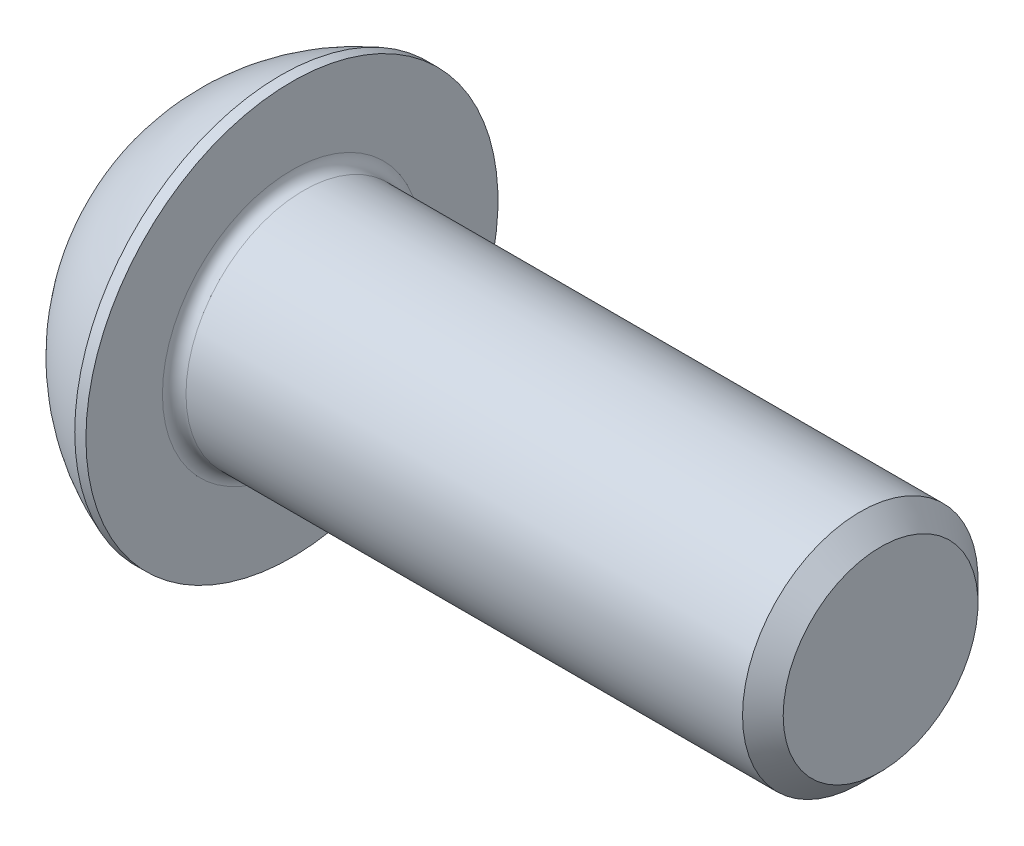
ISO-10303-21;
HEADER;
FILE_DESCRIPTION(('STEP AP214'),'2;1');
FILE_NAME('part.step','',(''),(''),'','','');
FILE_SCHEMA(('AUTOMOTIVE_DESIGN { 1 0 10303 214 1 1 1 1 }'));
ENDSEC;
DATA;
#1=APPLICATION_CONTEXT('core data for automotive mechanical design processes');
#2=APPLICATION_PROTOCOL_DEFINITION('international standard','automotive_design',2000,#1);
#3=PRODUCT_CONTEXT('',#1,'mechanical');
#4=PRODUCT('Part','Part','',(#3));
#5=PRODUCT_RELATED_PRODUCT_CATEGORY('part','',(#4));
#6=PRODUCT_DEFINITION_FORMATION('','',#4);
#7=PRODUCT_DEFINITION_CONTEXT('part definition',#1,'design');
#8=PRODUCT_DEFINITION('design','',#6,#7);
#9=PRODUCT_DEFINITION_SHAPE('','',#8);
#10=(LENGTH_UNIT() NAMED_UNIT(*) SI_UNIT(.MILLI.,.METRE.));
#11=(NAMED_UNIT(*) PLANE_ANGLE_UNIT() SI_UNIT($,.RADIAN.));
#12=(NAMED_UNIT(*) SI_UNIT($,.STERADIAN.) SOLID_ANGLE_UNIT());
#13=UNCERTAINTY_MEASURE_WITH_UNIT(LENGTH_MEASURE(1.E-05),#10,'distance_accuracy_value','');
#14=(GEOMETRIC_REPRESENTATION_CONTEXT(3) GLOBAL_UNCERTAINTY_ASSIGNED_CONTEXT((#13)) GLOBAL_UNIT_ASSIGNED_CONTEXT((#10,
#11,#12)) REPRESENTATION_CONTEXT('',''));
#15=CARTESIAN_POINT('',(0.,0.,0.));
#16=DIRECTION('',(0.,0.,1.));
#17=DIRECTION('',(1.,0.,0.));
#18=AXIS2_PLACEMENT_3D('',#15,#16,#17);
#19=CARTESIAN_POINT('',(0.,0.,0.));
#20=DIRECTION('',(-1.,0.,0.));
#21=DIRECTION('',(0.,0.,1.));
#22=AXIS2_PLACEMENT_3D('',#19,#20,#21);
#23=PLANE('',#22);
#24=CARTESIAN_POINT('',(0.,0.,0.));
#25=DIRECTION('',(-1.,0.,0.));
#26=DIRECTION('',(0.,0.,1.));
#27=AXIS2_PLACEMENT_3D('',#24,#25,#26);
#28=CIRCLE('',#27,3.5);
#29=CARTESIAN_POINT('',(0.,3.5,0.));
#30=VERTEX_POINT('',#29);
#31=EDGE_CURVE('E161',#30,#30,#28,.T.);
#32=ORIENTED_EDGE('',*,*,#31,.T.);
#33=EDGE_LOOP('',(#32));
#34=FACE_BOUND('',#33,.T.);
#35=DIRECTION('',(0.,-1.,0.));
#36=VECTOR('',#35,1.);
#37=CARTESIAN_POINT('',(0.,-1.44337567297406,2.5));
#38=LINE('',#37,#36);
#39=CARTESIAN_POINT('',(0.,1.44337567297407,2.5));
#40=VERTEX_POINT('',#39);
#41=CARTESIAN_POINT('',(0.,-1.44337567297406,2.5));
#42=VERTEX_POINT('',#41);
#43=EDGE_CURVE('E51',#40,#42,#38,.T.);
#44=ORIENTED_EDGE('',*,*,#43,.T.);
#45=DIRECTION('',(0.,-0.5,-0.866025403784438));
#46=VECTOR('',#45,1.);
#47=CARTESIAN_POINT('',(0.,-2.88675134594813,0.));
#48=LINE('',#47,#46);
#49=CARTESIAN_POINT('',(0.,-2.88675134594813,0.));
#50=VERTEX_POINT('',#49);
#51=EDGE_CURVE('E254',#42,#50,#48,.T.);
#52=ORIENTED_EDGE('',*,*,#51,.T.);
#53=DIRECTION('',(0.,0.5,-0.866025403784439));
#54=VECTOR('',#53,1.);
#55=CARTESIAN_POINT('',(0.,-1.44337567297406,-2.5));
#56=LINE('',#55,#54);
#57=CARTESIAN_POINT('',(0.,-1.44337567297406,-2.5));
#58=VERTEX_POINT('',#57);
#59=EDGE_CURVE('E136',#50,#58,#56,.T.);
#60=ORIENTED_EDGE('',*,*,#59,.T.);
#61=DIRECTION('',(0.,1.,0.));
#62=VECTOR('',#61,1.);
#63=CARTESIAN_POINT('',(0.,1.44337567297407,-2.5));
#64=LINE('',#63,#62);
#65=CARTESIAN_POINT('',(0.,1.44337567297407,-2.5));
#66=VERTEX_POINT('',#65);
#67=EDGE_CURVE('E257',#58,#66,#64,.T.);
#68=ORIENTED_EDGE('',*,*,#67,.T.);
#69=DIRECTION('',(0.,0.5,0.866025403784438));
#70=VECTOR('',#69,1.);
#71=CARTESIAN_POINT('',(0.,2.88675134594813,0.));
#72=LINE('',#71,#70);
#73=CARTESIAN_POINT('',(0.,2.88675134594813,0.));
#74=VERTEX_POINT('',#73);
#75=EDGE_CURVE('E259',#66,#74,#72,.T.);
#76=ORIENTED_EDGE('',*,*,#75,.T.);
#77=DIRECTION('',(0.,-0.5,0.866025403784438));
#78=VECTOR('',#77,1.);
#79=CARTESIAN_POINT('',(0.,1.44337567297407,2.5));
#80=LINE('',#79,#78);
#81=EDGE_CURVE('E261',#74,#40,#80,.T.);
#82=ORIENTED_EDGE('',*,*,#81,.T.);
#83=EDGE_LOOP('',(#44,#52,#60,#68,#76,#82));
#84=FACE_BOUND('',#83,.T.);
#85=ADVANCED_FACE('F36',(#34,#84),#23,.T.);
#86=CARTESIAN_POINT('',(6.58089552238806,0.,0.));
#87=DIRECTION('',(-1.,0.,0.));
#88=DIRECTION('',(0.,1.,0.));
#89=AXIS2_PLACEMENT_3D('',#86,#87,#88);
#90=SPHERICAL_SURFACE('',#89,7.45373637020972);
#91=CARTESIAN_POINT('',(4.02,0.,0.));
#92=DIRECTION('',(-1.,0.,0.));
#93=DIRECTION('',(0.,0.,1.));
#94=AXIS2_PLACEMENT_3D('',#91,#92,#93);
#95=CIRCLE('',#94,7.);
#96=CARTESIAN_POINT('',(4.02,7.,0.));
#97=VERTEX_POINT('',#96);
#98=EDGE_CURVE('E158',#97,#97,#95,.T.);
#99=CARTESIAN_POINT('',(4.02,7.,0.));
#100=CARTESIAN_POINT('',(3.96667727076465,6.98049242402172,0.));
#101=CARTESIAN_POINT('',(3.913577528648,6.96037534487455,0.));
#102=CARTESIAN_POINT('',(3.8078515532553,6.91893318326458,0.));
#103=CARTESIAN_POINT('',(3.75522531997925,6.89760810080177,0.));
#104=CARTESIAN_POINT('',(3.65047389687093,6.85376093558268,0.));
#105=CARTESIAN_POINT('',(3.59834870703866,6.83123885282639,0.));
#106=CARTESIAN_POINT('',(3.49462657751034,6.7850094841704,0.));
#107=CARTESIAN_POINT('',(3.44302963781429,6.7613021982707,0.));
#108=CARTESIAN_POINT('',(3.34039095714278,6.71271479411965,0.));
#109=CARTESIAN_POINT('',(3.28934921616733,6.6878346758683,0.));
#110=CARTESIAN_POINT('',(3.18784758682982,6.63691460241549,0.));
#111=CARTESIAN_POINT('',(3.13738769846775,6.61087464721403,0.));
#112=CARTESIAN_POINT('',(3.03707612567073,6.55764849769805,0.));
#113=CARTESIAN_POINT('',(2.98722444123577,6.53046230338352,0.));
#114=CARTESIAN_POINT('',(2.88815530965033,6.47495787293607,0.));
#115=CARTESIAN_POINT('',(2.83893786249984,6.44663963680314,0.));
#116=CARTESIAN_POINT('',(2.74116290772229,6.38888591095228,0.));
#117=CARTESIAN_POINT('',(2.69260540009523,6.35945042123436,0.));
#118=CARTESIAN_POINT('',(2.59617568194692,6.29947755995901,0.));
#119=CARTESIAN_POINT('',(2.54830347142567,6.2689401884016,0.));
#120=CARTESIAN_POINT('',(2.45326934720369,6.20677951059818,0.));
#121=CARTESIAN_POINT('',(2.40610743350296,6.17515620435217,0.));
#122=CARTESIAN_POINT('',(2.31251853170541,6.1108401714212,0.));
#123=CARTESIAN_POINT('',(2.2660915436086,6.07814744473625,0.));
#124=CARTESIAN_POINT('',(2.17399673801164,6.01170964364606,0.));
#125=CARTESIAN_POINT('',(2.12832892051151,5.97796456924083,0.));
#126=CARTESIAN_POINT('',(2.03777630464825,5.90943969498364,0.));
#127=CARTESIAN_POINT('',(1.99289150628513,5.87465989513168,0.));
#128=CARTESIAN_POINT('',(1.90392836832988,5.80408373260638,0.));
#129=CARTESIAN_POINT('',(1.85985002873775,5.76828736993305,0.));
#130=CARTESIAN_POINT('',(1.77252282681141,5.69569677525744,0.));
#131=CARTESIAN_POINT('',(1.72927396447721,5.65890254325517,0.));
#132=CARTESIAN_POINT('',(1.64362830238602,5.58433542451906,0.));
#133=CARTESIAN_POINT('',(1.60123150262904,5.54656253778523,0.));
#134=CARTESIAN_POINT('',(1.51731210604947,5.4700578352542,0.));
#135=CARTESIAN_POINT('',(1.47578950922687,5.431326019457,0.));
#136=CARTESIAN_POINT('',(1.39364020234904,5.35292368523707,0.));
#137=CARTESIAN_POINT('',(1.35301349229381,5.31325316681434,0.));
#138=CARTESIAN_POINT('',(1.27267717493576,5.23299414398831,0.));
#139=CARTESIAN_POINT('',(1.23296756763295,5.19240563958501,0.));
#140=CARTESIAN_POINT('',(1.15448619283766,5.1103318408312,0.));
#141=CARTESIAN_POINT('',(1.11571442534517,5.0688465464807,0.));
#142=CARTESIAN_POINT('',(1.03912897747163,4.98500083218559,0.));
#143=CARTESIAN_POINT('',(1.00131529709057,4.94264041224098,0.));
#144=CARTESIAN_POINT('',(0.926665770412102,4.85706656811615,0.));
#145=CARTESIAN_POINT('',(0.889829924114693,4.81385314393593,0.));
#146=CARTESIAN_POINT('',(0.817155301929323,4.72659585815459,0.));
#147=CARTESIAN_POINT('',(0.781316526041361,4.68255199655347,0.));
#148=CARTESIAN_POINT('',(0.710654760328621,4.59365683640532,0.));
#149=CARTESIAN_POINT('',(0.675831770503841,4.54880553785828,0.));
#150=CARTESIAN_POINT('',(0.607219762051194,4.45831892598402,0.));
#151=CARTESIAN_POINT('',(0.573430743423327,4.41268361265678,0.));
#152=CARTESIAN_POINT('',(0.506904322758881,4.32065280269138,0.));
#153=CARTESIAN_POINT('',(0.474166920722302,4.27425730605322,0.));
#154=CARTESIAN_POINT('',(0.409760828646038,4.18073035837463,0.));
#155=CARTESIAN_POINT('',(0.378092138606352,4.1335989073342,0.));
#156=CARTESIAN_POINT('',(0.31584001087466,4.03862466237799,0.));
#157=CARTESIAN_POINT('',(0.285256573182654,3.99078186846222,0.));
#158=CARTESIAN_POINT('',(0.2251909123934,3.89440992714022,0.));
#159=CARTESIAN_POINT('',(0.195708689296152,3.84588077973399,0.));
#160=CARTESIAN_POINT('',(0.137860887287448,3.74816145542334,0.));
#161=CARTESIAN_POINT('',(0.109495308375992,3.69897127851891,0.));
#162=CARTESIAN_POINT('',(0.0538954828937622,3.59995565329747,0.));
#163=CARTESIAN_POINT('',(0.0266612363229883,3.55013020498047,0.));
#164=CARTESIAN_POINT('',(0.,3.5,0.));
#165=B_SPLINE_CURVE_WITH_KNOTS('',3,(#99,#100,#101,#102,#103,#104,#105,#106,#107,#108,#109,#110,
#111,#112,#113,#114,#115,#116,#117,#118,#119,#120,#121,#122,#123,#124,#125,#126,#127,#128,#129,
#130,#131,#132,#133,#134,#135,#136,#137,#138,#139,#140,#141,#142,#143,#144,#145,#146,#147,#148,
#149,#150,#151,#152,#153,#154,#155,#156,#157,#158,#159,#160,#161,#162,#163,#164),.UNSPECIFIED.,
.F.,.F.,(4,2,2,2,2,2,2,2,2,2,2,2,2,2,2,2,2,2,2,2,2,2,2,2,2,2,2,2,2,2,2,2,4),(0.,
0.170333394580244,0.340666789160487,0.51100018374073,0.681333578320973,0.851666972901216,
1.02200036748146,1.1923337620617,1.36266715664194,1.53300055122219,1.70333394580243,
1.87366734038267,2.04400073496292,2.21433412954316,2.3846675241234,2.55500091870365,
2.72533431328389,2.89566770786413,3.06600110244437,3.23633449702462,3.40666789160486,
3.5770012861851,3.74733468076535,3.91766807534559,4.08800146992583,4.25833486450608,
4.42866825908632,4.59900165366656,4.76933504824681,4.93966844282705,5.11000183740729,
5.28033523198754,5.45066862656778),.UNSPECIFIED.);
#166=EDGE_CURVE('BSEAM182',#97,#30,#165,.T.);
#167=ORIENTED_EDGE('',*,*,#98,.T.);
#168=ORIENTED_EDGE('',*,*,#31,.F.);
#169=ORIENTED_EDGE('',*,*,#166,.T.);
#170=ORIENTED_EDGE('',*,*,#166,.F.);
#171=EDGE_LOOP('',(#167,#169,#168,#170));
#172=FACE_BOUND('',#171,.T.);
#173=ADVANCED_FACE('F182',(#172),#90,.T.);
#174=CARTESIAN_POINT('',(0.,0.,0.));
#175=DIRECTION('',(-1.,0.,0.));
#176=DIRECTION('',(0.,0.,1.));
#177=AXIS2_PLACEMENT_3D('',#174,#175,#176);
#178=CYLINDRICAL_SURFACE('',#177,7.);
#179=ORIENTED_EDGE('',*,*,#98,.F.);
#180=EDGE_LOOP('',(#179));
#181=FACE_BOUND('',#180,.T.);
#182=CARTESIAN_POINT('',(4.4,0.,0.));
#183=DIRECTION('',(-1.,0.,0.));
#184=DIRECTION('',(0.,0.,1.));
#185=AXIS2_PLACEMENT_3D('',#182,#183,#184);
#186=CIRCLE('',#185,7.);
#187=CARTESIAN_POINT('',(4.4,0.,7.));
#188=VERTEX_POINT('',#187);
#189=EDGE_CURVE('E155',#188,#188,#186,.T.);
#190=ORIENTED_EDGE('',*,*,#189,.T.);
#191=EDGE_LOOP('',(#190));
#192=FACE_BOUND('',#191,.T.);
#193=ADVANCED_FACE('F187',(#181,#192),#178,.T.);
#194=CARTESIAN_POINT('',(4.4,4.,0.));
#195=DIRECTION('',(-1.,0.,0.));
#196=DIRECTION('',(0.,0.,1.));
#197=AXIS2_PLACEMENT_3D('',#194,#195,#196);
#198=PLANE('',#197);
#199=CARTESIAN_POINT('',(4.4,0.,0.));
#200=DIRECTION('',(-1.,0.,0.));
#201=DIRECTION('',(0.,0.,1.));
#202=AXIS2_PLACEMENT_3D('',#199,#200,#201);
#203=CIRCLE('',#202,4.4);
#204=CARTESIAN_POINT('',(4.4,0.,4.4));
#205=VERTEX_POINT('',#204);
#206=EDGE_CURVE('E44',#205,#205,#203,.T.);
#207=ORIENTED_EDGE('',*,*,#206,.T.);
#208=EDGE_LOOP('',(#207));
#209=FACE_BOUND('',#208,.T.);
#210=ORIENTED_EDGE('',*,*,#189,.F.);
#211=EDGE_LOOP('',(#210));
#212=FACE_BOUND('',#211,.T.);
#213=ADVANCED_FACE('F166',(#209,#212),#198,.F.);
#214=CARTESIAN_POINT('',(0.,0.,0.));
#215=DIRECTION('',(-1.,0.,0.));
#216=DIRECTION('',(0.,0.,1.));
#217=AXIS2_PLACEMENT_3D('',#214,#215,#216);
#218=CYLINDRICAL_SURFACE('',#217,4.);
#219=CARTESIAN_POINT('',(4.8,0.,0.));
#220=DIRECTION('',(-1.,0.,0.));
#221=DIRECTION('',(0.,0.,1.));
#222=AXIS2_PLACEMENT_3D('',#219,#220,#221);
#223=CIRCLE('',#222,4.);
#224=CARTESIAN_POINT('',(4.8,0.,4.));
#225=VERTEX_POINT('',#224);
#226=EDGE_CURVE('E11',#225,#225,#223,.F.);
#227=ORIENTED_EDGE('',*,*,#226,.T.);
#228=EDGE_LOOP('',(#227));
#229=FACE_BOUND('',#228,.T.);
#230=CARTESIAN_POINT('',(23.7095,0.,0.));
#231=DIRECTION('',(-1.,0.,0.));
#232=DIRECTION('',(0.,0.,1.));
#233=AXIS2_PLACEMENT_3D('',#230,#231,#232);
#234=CIRCLE('',#233,4.);
#235=CARTESIAN_POINT('',(23.7095,0.,4.));
#236=VERTEX_POINT('',#235);
#237=EDGE_CURVE('E152',#236,#236,#234,.T.);
#238=ORIENTED_EDGE('',*,*,#237,.T.);
#239=EDGE_LOOP('',(#238));
#240=FACE_BOUND('',#239,.T.);
#241=ADVANCED_FACE('F196',(#229,#240),#218,.T.);
#242=CARTESIAN_POINT('',(24.4,0.,0.));
#243=DIRECTION('',(-1.,0.,0.));
#244=DIRECTION('',(0.,0.,1.));
#245=AXIS2_PLACEMENT_3D('',#242,#243,#244);
#246=CONICAL_SURFACE('',#245,3.3095,0.785398163397445);
#247=ORIENTED_EDGE('',*,*,#237,.F.);
#248=EDGE_LOOP('',(#247));
#249=FACE_BOUND('',#248,.T.);
#250=CARTESIAN_POINT('',(24.4,0.,0.));
#251=DIRECTION('',(-1.,0.,0.));
#252=DIRECTION('',(0.,0.,1.));
#253=AXIS2_PLACEMENT_3D('',#250,#251,#252);
#254=CIRCLE('',#253,3.3095);
#255=CARTESIAN_POINT('',(24.4,0.,3.3095));
#256=VERTEX_POINT('',#255);
#257=EDGE_CURVE('E148',#256,#256,#254,.T.);
#258=ORIENTED_EDGE('',*,*,#257,.T.);
#259=EDGE_LOOP('',(#258));
#260=FACE_BOUND('',#259,.T.);
#261=ADVANCED_FACE('F177',(#249,#260),#246,.T.);
#262=CARTESIAN_POINT('',(24.4,0.,0.));
#263=DIRECTION('',(-1.,0.,0.));
#264=DIRECTION('',(0.,0.,1.));
#265=AXIS2_PLACEMENT_3D('',#262,#263,#264);
#266=PLANE('',#265);
#267=ORIENTED_EDGE('',*,*,#257,.F.);
#268=EDGE_LOOP('',(#267));
#269=FACE_BOUND('',#268,.T.);
#270=ADVANCED_FACE('F170',(#269),#266,.F.);
#271=CARTESIAN_POINT('',(4.8,0.,0.));
#272=DIRECTION('',(-1.,0.,0.));
#273=DIRECTION('',(0.,0.,1.));
#274=AXIS2_PLACEMENT_3D('',#271,#272,#273);
#275=TOROIDAL_SURFACE('',#274,4.4,0.4);
#276=ORIENTED_EDGE('',*,*,#226,.F.);
#277=EDGE_LOOP('',(#276));
#278=FACE_BOUND('',#277,.T.);
#279=ORIENTED_EDGE('',*,*,#206,.F.);
#280=EDGE_LOOP('',(#279));
#281=FACE_BOUND('',#280,.T.);
#282=ADVANCED_FACE('F38',(#278,#281),#275,.F.);
#283=CARTESIAN_POINT('',(2.6,-2.88675134594813,0.));
#284=DIRECTION('',(0.,0.866025403784438,-0.5));
#285=DIRECTION('',(0.,0.5,0.866025403784439));
#286=AXIS2_PLACEMENT_3D('',#283,#284,#285);
#287=PLANE('',#286);
#288=DIRECTION('',(0.,-0.5,-0.866025403784438));
#289=VECTOR('',#288,1.);
#290=CARTESIAN_POINT('',(2.6,-2.88675134594813,0.));
#291=LINE('',#290,#289);
#292=CARTESIAN_POINT('',(2.6,-1.44337567297406,2.5));
#293=VERTEX_POINT('',#292);
#294=CARTESIAN_POINT('',(2.6,-2.1650635094611,1.25));
#295=VERTEX_POINT('',#294);
#296=EDGE_CURVE('E119',#293,#295,#291,.T.);
#297=ORIENTED_EDGE('',*,*,#296,.T.);
#298=CARTESIAN_POINT('',(2.6,-2.88675134594813,0.));
#299=VERTEX_POINT('',#298);
#300=EDGE_CURVE('E112',#295,#299,#291,.T.);
#301=ORIENTED_EDGE('',*,*,#300,.T.);
#302=DIRECTION('',(-1.,0.,0.));
#303=VECTOR('',#302,1.);
#304=CARTESIAN_POINT('',(2.6,-2.88675134594813,0.));
#305=LINE('',#304,#303);
#306=EDGE_CURVE('E116',#299,#50,#305,.T.);
#307=ORIENTED_EDGE('',*,*,#306,.T.);
#308=ORIENTED_EDGE('',*,*,#51,.F.);
#309=DIRECTION('',(-1.,0.,0.));
#310=VECTOR('',#309,1.);
#311=CARTESIAN_POINT('',(2.6,-1.44337567297406,2.5));
#312=LINE('',#311,#310);
#313=EDGE_CURVE('E244',#293,#42,#312,.T.);
#314=ORIENTED_EDGE('',*,*,#313,.F.);
#315=EDGE_LOOP('',(#297,#301,#307,#308,#314));
#316=FACE_BOUND('',#315,.T.);
#317=ADVANCED_FACE('F114',(#316),#287,.T.);
#318=CARTESIAN_POINT('',(2.6,-1.44337567297406,-2.5));
#319=DIRECTION('',(0.,0.866025403784439,0.5));
#320=DIRECTION('',(0.,-0.5,0.866025403784439));
#321=AXIS2_PLACEMENT_3D('',#318,#319,#320);
#322=PLANE('',#321);
#323=DIRECTION('',(0.,0.5,-0.866025403784439));
#324=VECTOR('',#323,1.);
#325=CARTESIAN_POINT('',(2.6,-1.44337567297406,-2.5));
#326=LINE('',#325,#324);
#327=CARTESIAN_POINT('',(2.6,-2.1650635094611,-1.25));
#328=VERTEX_POINT('',#327);
#329=EDGE_CURVE('E124',#299,#328,#326,.T.);
#330=ORIENTED_EDGE('',*,*,#329,.T.);
#331=CARTESIAN_POINT('',(2.6,-1.44337567297406,-2.5));
#332=VERTEX_POINT('',#331);
#333=EDGE_CURVE('E131',#328,#332,#326,.T.);
#334=ORIENTED_EDGE('',*,*,#333,.T.);
#335=DIRECTION('',(-1.,0.,0.));
#336=VECTOR('',#335,1.);
#337=CARTESIAN_POINT('',(2.6,-1.44337567297406,-2.5));
#338=LINE('',#337,#336);
#339=EDGE_CURVE('E138',#332,#58,#338,.T.);
#340=ORIENTED_EDGE('',*,*,#339,.T.);
#341=ORIENTED_EDGE('',*,*,#59,.F.);
#342=ORIENTED_EDGE('',*,*,#306,.F.);
#343=EDGE_LOOP('',(#330,#334,#340,#341,#342));
#344=FACE_BOUND('',#343,.T.);
#345=ADVANCED_FACE('F134',(#344),#322,.T.);
#346=CARTESIAN_POINT('',(2.6,1.44337567297407,-2.5));
#347=DIRECTION('',(0.,0.,1.));
#348=DIRECTION('',(1.,0.,0.));
#349=AXIS2_PLACEMENT_3D('',#346,#347,#348);
#350=PLANE('',#349);
#351=DIRECTION('',(0.,1.,0.));
#352=VECTOR('',#351,1.);
#353=CARTESIAN_POINT('',(2.6,1.44337567297407,-2.5));
#354=LINE('',#353,#352);
#355=CARTESIAN_POINT('',(2.6,0.,-2.5));
#356=VERTEX_POINT('',#355);
#357=EDGE_CURVE('E280',#332,#356,#354,.T.);
#358=ORIENTED_EDGE('',*,*,#357,.T.);
#359=CARTESIAN_POINT('',(2.6,1.44337567297407,-2.5));
#360=VERTEX_POINT('',#359);
#361=EDGE_CURVE('E130',#356,#360,#354,.T.);
#362=ORIENTED_EDGE('',*,*,#361,.T.);
#363=DIRECTION('',(-1.,0.,0.));
#364=VECTOR('',#363,1.);
#365=CARTESIAN_POINT('',(2.6,1.44337567297407,-2.5));
#366=LINE('',#365,#364);
#367=EDGE_CURVE('E143',#360,#66,#366,.T.);
#368=ORIENTED_EDGE('',*,*,#367,.T.);
#369=ORIENTED_EDGE('',*,*,#67,.F.);
#370=ORIENTED_EDGE('',*,*,#339,.F.);
#371=EDGE_LOOP('',(#358,#362,#368,#369,#370));
#372=FACE_BOUND('',#371,.T.);
#373=ADVANCED_FACE('F210',(#372),#350,.T.);
#374=CARTESIAN_POINT('',(2.6,2.88675134594813,0.));
#375=DIRECTION('',(0.,-0.866025403784438,0.5));
#376=DIRECTION('',(0.,-0.5,-0.866025403784439));
#377=AXIS2_PLACEMENT_3D('',#374,#375,#376);
#378=PLANE('',#377);
#379=DIRECTION('',(0.,0.5,0.866025403784438));
#380=VECTOR('',#379,1.);
#381=CARTESIAN_POINT('',(2.6,2.88675134594813,0.));
#382=LINE('',#381,#380);
#383=CARTESIAN_POINT('',(2.6,2.1650635094611,-1.25));
#384=VERTEX_POINT('',#383);
#385=EDGE_CURVE('E286',#360,#384,#382,.T.);
#386=ORIENTED_EDGE('',*,*,#385,.T.);
#387=CARTESIAN_POINT('',(2.6,2.88675134594813,0.));
#388=VERTEX_POINT('',#387);
#389=EDGE_CURVE('E284',#384,#388,#382,.T.);
#390=ORIENTED_EDGE('',*,*,#389,.T.);
#391=DIRECTION('',(-1.,0.,0.));
#392=VECTOR('',#391,1.);
#393=CARTESIAN_POINT('',(2.6,2.88675134594813,0.));
#394=LINE('',#393,#392);
#395=EDGE_CURVE('E266',#388,#74,#394,.T.);
#396=ORIENTED_EDGE('',*,*,#395,.T.);
#397=ORIENTED_EDGE('',*,*,#75,.F.);
#398=ORIENTED_EDGE('',*,*,#367,.F.);
#399=EDGE_LOOP('',(#386,#390,#396,#397,#398));
#400=FACE_BOUND('',#399,.T.);
#401=ADVANCED_FACE('F213',(#400),#378,.T.);
#402=CARTESIAN_POINT('',(2.6,1.44337567297407,2.5));
#403=DIRECTION('',(0.,-0.866025403784438,-0.5));
#404=DIRECTION('',(0.,0.5,-0.866025403784438));
#405=AXIS2_PLACEMENT_3D('',#402,#403,#404);
#406=PLANE('',#405);
#407=DIRECTION('',(0.,-0.5,0.866025403784438));
#408=VECTOR('',#407,1.);
#409=CARTESIAN_POINT('',(2.6,1.44337567297407,2.5));
#410=LINE('',#409,#408);
#411=CARTESIAN_POINT('',(2.6,2.1650635094611,1.25));
#412=VERTEX_POINT('',#411);
#413=EDGE_CURVE('E250',#388,#412,#410,.T.);
#414=ORIENTED_EDGE('',*,*,#413,.T.);
#415=CARTESIAN_POINT('',(2.6,1.44337567297407,2.5));
#416=VERTEX_POINT('',#415);
#417=EDGE_CURVE('E242',#412,#416,#410,.T.);
#418=ORIENTED_EDGE('',*,*,#417,.T.);
#419=DIRECTION('',(-1.,0.,0.));
#420=VECTOR('',#419,1.);
#421=CARTESIAN_POINT('',(2.6,1.44337567297407,2.5));
#422=LINE('',#421,#420);
#423=EDGE_CURVE('E248',#416,#40,#422,.T.);
#424=ORIENTED_EDGE('',*,*,#423,.T.);
#425=ORIENTED_EDGE('',*,*,#81,.F.);
#426=ORIENTED_EDGE('',*,*,#395,.F.);
#427=EDGE_LOOP('',(#414,#418,#424,#425,#426));
#428=FACE_BOUND('',#427,.T.);
#429=ADVANCED_FACE('F217',(#428),#406,.T.);
#430=CARTESIAN_POINT('',(2.6,-1.44337567297406,2.5));
#431=DIRECTION('',(0.,0.,-1.));
#432=DIRECTION('',(-1.,0.,0.));
#433=AXIS2_PLACEMENT_3D('',#430,#431,#432);
#434=PLANE('',#433);
#435=DIRECTION('',(0.,-1.,0.));
#436=VECTOR('',#435,1.);
#437=CARTESIAN_POINT('',(2.6,-1.44337567297406,2.5));
#438=LINE('',#437,#436);
#439=CARTESIAN_POINT('',(2.6,0.,2.5));
#440=VERTEX_POINT('',#439);
#441=EDGE_CURVE('E59',#416,#440,#438,.T.);
#442=ORIENTED_EDGE('',*,*,#441,.T.);
#443=EDGE_CURVE('E245',#440,#293,#438,.T.);
#444=ORIENTED_EDGE('',*,*,#443,.T.);
#445=ORIENTED_EDGE('',*,*,#313,.T.);
#446=ORIENTED_EDGE('',*,*,#43,.F.);
#447=ORIENTED_EDGE('',*,*,#423,.F.);
#448=EDGE_LOOP('',(#442,#444,#445,#446,#447));
#449=FACE_BOUND('',#448,.T.);
#450=ADVANCED_FACE('F221',(#449),#434,.T.);
#451=CARTESIAN_POINT('',(2.6,0.,5.));
#452=DIRECTION('',(-1.,0.,0.));
#453=DIRECTION('',(0.,0.,1.));
#454=AXIS2_PLACEMENT_3D('',#451,#452,#453);
#455=PLANE('',#454);
#456=ORIENTED_EDGE('',*,*,#441,.F.);
#457=ORIENTED_EDGE('',*,*,#417,.F.);
#458=CARTESIAN_POINT('',(2.6,0.,0.));
#459=DIRECTION('',(-1.,0.,0.));
#460=DIRECTION('',(0.,0.,1.));
#461=AXIS2_PLACEMENT_3D('',#458,#459,#460);
#462=CIRCLE('',#461,2.5);
#463=EDGE_CURVE('E142',#440,#412,#462,.T.);
#464=ORIENTED_EDGE('',*,*,#463,.F.);
#465=EDGE_LOOP('',(#456,#457,#464));
#466=FACE_BOUND('',#465,.T.);
#467=ADVANCED_FACE('F225',(#466),#455,.T.);
#468=ORIENTED_EDGE('',*,*,#413,.F.);
#469=ORIENTED_EDGE('',*,*,#389,.F.);
#470=EDGE_CURVE('E149',#412,#384,#462,.T.);
#471=ORIENTED_EDGE('',*,*,#470,.F.);
#472=EDGE_LOOP('',(#468,#469,#471));
#473=FACE_BOUND('',#472,.T.);
#474=ADVANCED_FACE('F233',(#473),#455,.T.);
#475=ORIENTED_EDGE('',*,*,#385,.F.);
#476=ORIENTED_EDGE('',*,*,#361,.F.);
#477=EDGE_CURVE('E291',#384,#356,#462,.T.);
#478=ORIENTED_EDGE('',*,*,#477,.F.);
#479=EDGE_LOOP('',(#475,#476,#478));
#480=FACE_BOUND('',#479,.T.);
#481=ADVANCED_FACE('F238',(#480),#455,.T.);
#482=ORIENTED_EDGE('',*,*,#357,.F.);
#483=ORIENTED_EDGE('',*,*,#333,.F.);
#484=EDGE_CURVE('E283',#356,#328,#462,.T.);
#485=ORIENTED_EDGE('',*,*,#484,.F.);
#486=EDGE_LOOP('',(#482,#483,#485));
#487=FACE_BOUND('',#486,.T.);
#488=ADVANCED_FACE('F231',(#487),#455,.T.);
#489=ORIENTED_EDGE('',*,*,#329,.F.);
#490=ORIENTED_EDGE('',*,*,#300,.F.);
#491=EDGE_CURVE('E126',#328,#295,#462,.T.);
#492=ORIENTED_EDGE('',*,*,#491,.F.);
#493=EDGE_LOOP('',(#489,#490,#492));
#494=FACE_BOUND('',#493,.T.);
#495=ADVANCED_FACE('F125',(#494),#455,.T.);
#496=ORIENTED_EDGE('',*,*,#296,.F.);
#497=ORIENTED_EDGE('',*,*,#443,.F.);
#498=EDGE_CURVE('E137',#295,#440,#462,.T.);
#499=ORIENTED_EDGE('',*,*,#498,.F.);
#500=EDGE_LOOP('',(#496,#497,#499));
#501=FACE_BOUND('',#500,.T.);
#502=ADVANCED_FACE('F205',(#501),#455,.T.);
#503=CARTESIAN_POINT('',(4.04337567297408,0.,0.));
#504=DIRECTION('',(-1.,0.,0.));
#505=DIRECTION('',(0.,0.,1.));
#506=AXIS2_PLACEMENT_3D('',#503,#504,#505);
#507=CONICAL_SURFACE('',#506,0.,1.04719755119659);
#508=ORIENTED_EDGE('',*,*,#463,.T.);
#509=ORIENTED_EDGE('',*,*,#470,.T.);
#510=ORIENTED_EDGE('',*,*,#477,.T.);
#511=ORIENTED_EDGE('',*,*,#484,.T.);
#512=ORIENTED_EDGE('',*,*,#491,.T.);
#513=ORIENTED_EDGE('',*,*,#498,.T.);
#514=EDGE_LOOP('',(#508,#509,#510,#511,#512,#513));
#515=FACE_BOUND('',#514,.T.);
#516=CARTESIAN_POINT('',(4.04337567297408,0.,0.));
#517=VERTEX_POINT('',#516);
#518=VERTEX_LOOP('',#517);
#519=FACE_BOUND('',#518,.T.);
#520=ADVANCED_FACE('F203',(#515,#519),#507,.F.);
#521=CLOSED_SHELL('',(#85,#173,#193,#213,#241,#261,#270,#282,#317,#345,#373,#401,#429,#450,#467,
#474,#481,#488,#495,#502,#520));
#522=MANIFOLD_SOLID_BREP('B2',#521);
#523=ADVANCED_BREP_SHAPE_REPRESENTATION('',(#18,#522),#14);
#524=SHAPE_DEFINITION_REPRESENTATION(#9,#523);
ENDSEC;
END-ISO-10303-21;
